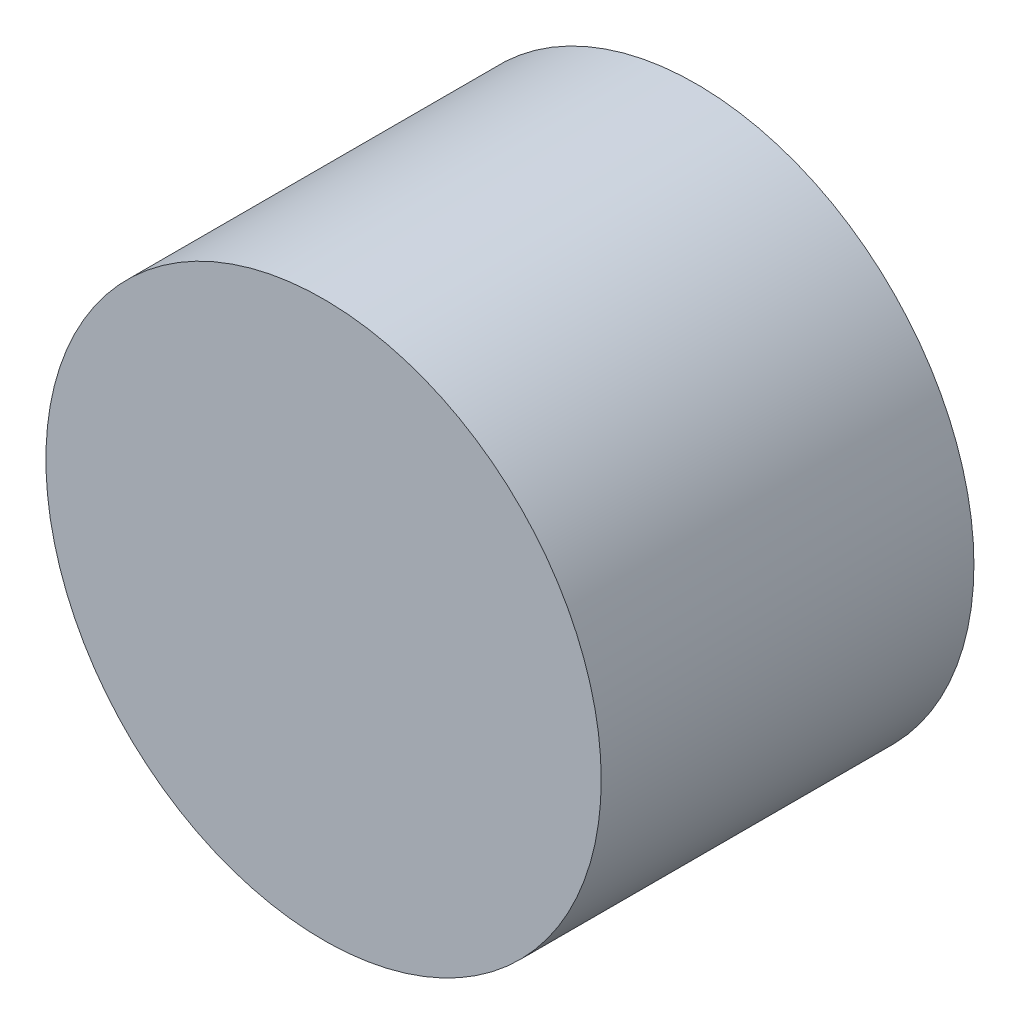
ISO-10303-21;
HEADER;
FILE_DESCRIPTION(('STEP AP214'),'2;1');
FILE_NAME('part.step','',(''),(''),'','','');
FILE_SCHEMA(('AUTOMOTIVE_DESIGN { 1 0 10303 214 1 1 1 1 }'));
ENDSEC;
DATA;
#1=APPLICATION_CONTEXT('core data for automotive mechanical design processes');
#2=APPLICATION_PROTOCOL_DEFINITION('international standard','automotive_design',2000,#1);
#3=PRODUCT_CONTEXT('',#1,'mechanical');
#4=PRODUCT('Part','Part','',(#3));
#5=PRODUCT_RELATED_PRODUCT_CATEGORY('part','',(#4));
#6=PRODUCT_DEFINITION_FORMATION('','',#4);
#7=PRODUCT_DEFINITION_CONTEXT('part definition',#1,'design');
#8=PRODUCT_DEFINITION('design','',#6,#7);
#9=PRODUCT_DEFINITION_SHAPE('','',#8);
#10=(LENGTH_UNIT() NAMED_UNIT(*) SI_UNIT(.MILLI.,.METRE.));
#11=(NAMED_UNIT(*) PLANE_ANGLE_UNIT() SI_UNIT($,.RADIAN.));
#12=(NAMED_UNIT(*) SI_UNIT($,.STERADIAN.) SOLID_ANGLE_UNIT());
#13=UNCERTAINTY_MEASURE_WITH_UNIT(LENGTH_MEASURE(1.E-05),#10,'distance_accuracy_value','');
#14=(GEOMETRIC_REPRESENTATION_CONTEXT(3) GLOBAL_UNCERTAINTY_ASSIGNED_CONTEXT((#13)) GLOBAL_UNIT_ASSIGNED_CONTEXT((#10,
#11,#12)) REPRESENTATION_CONTEXT('',''));
#15=CARTESIAN_POINT('',(0.,0.,0.));
#16=DIRECTION('',(0.,0.,1.));
#17=DIRECTION('',(1.,0.,0.));
#18=AXIS2_PLACEMENT_3D('',#15,#16,#17);
#19=CARTESIAN_POINT('',(0.,0.,0.1));
#20=DIRECTION('',(0.,0.,1.));
#21=DIRECTION('',(1.,0.,0.));
#22=AXIS2_PLACEMENT_3D('',#19,#20,#21);
#23=PLANE('',#22);
#24=CARTESIAN_POINT('',(3.8015,-2.7305,0.1));
#25=DIRECTION('',(0.,0.,1.));
#26=DIRECTION('',(1.,0.,0.));
#27=AXIS2_PLACEMENT_3D('',#24,#25,#26);
#28=CIRCLE('',#27,0.07450167783346);
#29=CARTESIAN_POINT('',(3.87600167783346,-2.7305,0.1));
#30=VERTEX_POINT('',#29);
#31=EDGE_CURVE('E18',#30,#30,#28,.F.);
#32=ORIENTED_EDGE('',*,*,#31,.F.);
#33=EDGE_LOOP('',(#32));
#34=FACE_BOUND('',#33,.T.);
#35=ADVANCED_FACE('F15',(#34),#23,.T.);
#36=CARTESIAN_POINT('',(0.,0.,0.));
#37=DIRECTION('',(0.,0.,1.));
#38=DIRECTION('',(1.,0.,0.));
#39=AXIS2_PLACEMENT_3D('',#36,#37,#38);
#40=PLANE('',#39);
#41=CARTESIAN_POINT('',(3.8015,-2.7305,0.));
#42=DIRECTION('',(0.,0.,1.));
#43=DIRECTION('',(1.,0.,0.));
#44=AXIS2_PLACEMENT_3D('',#41,#42,#43);
#45=CIRCLE('',#44,0.07450167783346);
#46=CARTESIAN_POINT('',(3.87600167783346,-2.7305,0.));
#47=VERTEX_POINT('',#46);
#48=EDGE_CURVE('E10',#47,#47,#45,.T.);
#49=ORIENTED_EDGE('',*,*,#48,.F.);
#50=EDGE_LOOP('',(#49));
#51=FACE_BOUND('',#50,.T.);
#52=ADVANCED_FACE('F30',(#51),#40,.F.);
#53=CARTESIAN_POINT('',(3.8015,-2.7305,0.));
#54=DIRECTION('',(0.,0.,1.));
#55=DIRECTION('',(1.,0.,0.));
#56=AXIS2_PLACEMENT_3D('',#53,#54,#55);
#57=CYLINDRICAL_SURFACE('',#56,0.07450167783346);
#58=ORIENTED_EDGE('',*,*,#31,.T.);
#59=EDGE_LOOP('',(#58));
#60=FACE_BOUND('',#59,.T.);
#61=ORIENTED_EDGE('',*,*,#48,.T.);
#62=EDGE_LOOP('',(#61));
#63=FACE_BOUND('',#62,.T.);
#64=ADVANCED_FACE('F27',(#60,#63),#57,.T.);
#65=CLOSED_SHELL('',(#35,#52,#64));
#66=MANIFOLD_SOLID_BREP('B1',#65);
#67=ADVANCED_BREP_SHAPE_REPRESENTATION('',(#18,#66),#14);
#68=SHAPE_DEFINITION_REPRESENTATION(#9,#67);
ENDSEC;
END-ISO-10303-21;
